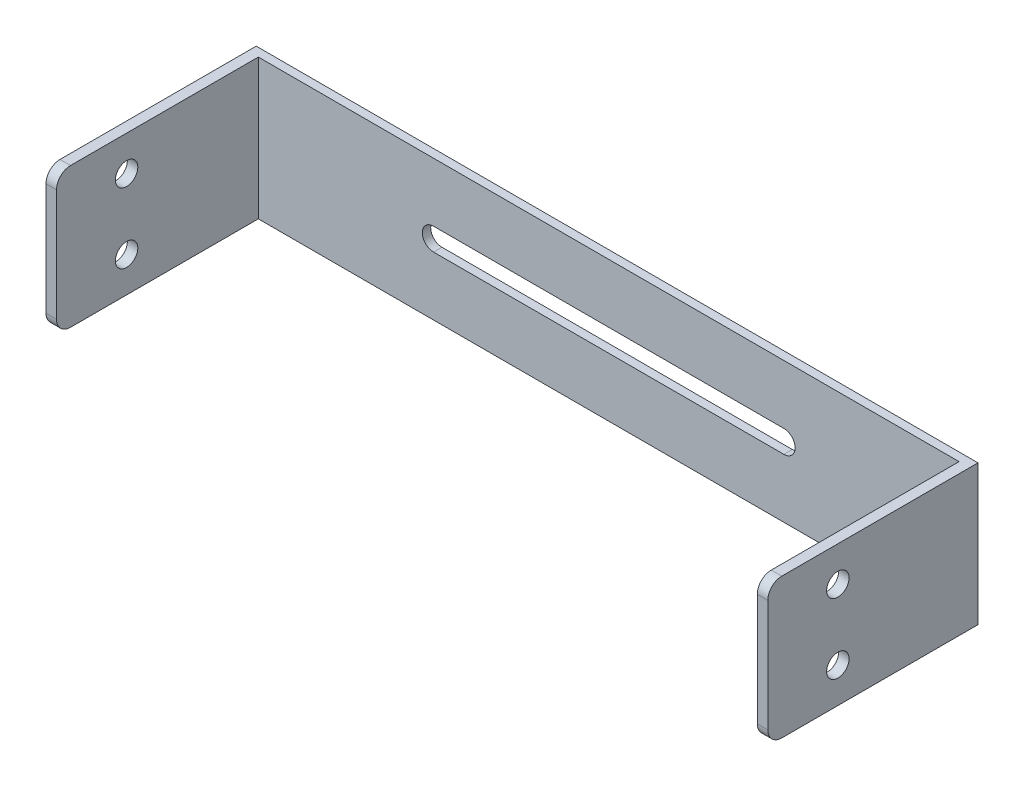
ISO-10303-21;
HEADER;
FILE_DESCRIPTION(('STEP AP214'),'2;1');
FILE_NAME('part.step','',(''),(''),'','','');
FILE_SCHEMA(('AUTOMOTIVE_DESIGN { 1 0 10303 214 1 1 1 1 }'));
ENDSEC;
DATA;
#1=APPLICATION_CONTEXT('core data for automotive mechanical design processes');
#2=APPLICATION_PROTOCOL_DEFINITION('international standard','automotive_design',2000,#1);
#3=PRODUCT_CONTEXT('',#1,'mechanical');
#4=PRODUCT('Part','Part','',(#3));
#5=PRODUCT_RELATED_PRODUCT_CATEGORY('part','',(#4));
#6=PRODUCT_DEFINITION_FORMATION('','',#4);
#7=PRODUCT_DEFINITION_CONTEXT('part definition',#1,'design');
#8=PRODUCT_DEFINITION('design','',#6,#7);
#9=PRODUCT_DEFINITION_SHAPE('','',#8);
#10=(LENGTH_UNIT() NAMED_UNIT(*) SI_UNIT(.MILLI.,.METRE.));
#11=(NAMED_UNIT(*) PLANE_ANGLE_UNIT() SI_UNIT($,.RADIAN.));
#12=(NAMED_UNIT(*) SI_UNIT($,.STERADIAN.) SOLID_ANGLE_UNIT());
#13=UNCERTAINTY_MEASURE_WITH_UNIT(LENGTH_MEASURE(1.E-05),#10,'distance_accuracy_value','');
#14=(GEOMETRIC_REPRESENTATION_CONTEXT(3) GLOBAL_UNCERTAINTY_ASSIGNED_CONTEXT((#13)) GLOBAL_UNIT_ASSIGNED_CONTEXT((#10,
#11,#12)) REPRESENTATION_CONTEXT('',''));
#15=CARTESIAN_POINT('',(0.,0.,0.));
#16=DIRECTION('',(0.,0.,1.));
#17=DIRECTION('',(1.,0.,0.));
#18=AXIS2_PLACEMENT_3D('',#15,#16,#17);
#19=CARTESIAN_POINT('',(65.,0.,0.));
#20=DIRECTION('',(1.,0.,0.));
#21=DIRECTION('',(0.,0.,1.));
#22=AXIS2_PLACEMENT_3D('',#19,#20,#21);
#23=PLANE('',#22);
#24=CARTESIAN_POINT('',(65.,49.0000000000004,-95.5));
#25=DIRECTION('',(1.,0.,0.));
#26=DIRECTION('',(0.,0.,-1.));
#27=AXIS2_PLACEMENT_3D('',#24,#25,#26);
#28=CIRCLE('',#27,1.60000000000001);
#29=CARTESIAN_POINT('',(65.,49.0000000000004,-97.1));
#30=VERTEX_POINT('',#29);
#31=EDGE_CURVE('E405',#30,#30,#28,.T.);
#32=ORIENTED_EDGE('',*,*,#31,.T.);
#33=EDGE_LOOP('',(#32));
#34=FACE_BOUND('',#33,.T.);
#35=CARTESIAN_POINT('',(65.,59.0000000000004,-95.5));
#36=DIRECTION('',(1.,0.,0.));
#37=DIRECTION('',(0.,0.,-1.));
#38=AXIS2_PLACEMENT_3D('',#35,#36,#37);
#39=CIRCLE('',#38,1.59999999999998);
#40=CARTESIAN_POINT('',(65.,59.0000000000004,-97.1));
#41=VERTEX_POINT('',#40);
#42=EDGE_CURVE('E399',#41,#41,#39,.T.);
#43=ORIENTED_EDGE('',*,*,#42,.T.);
#44=EDGE_LOOP('',(#43));
#45=FACE_BOUND('',#44,.T.);
#46=DIRECTION('',(0.,1.,0.));
#47=VECTOR('',#46,1.);
#48=CARTESIAN_POINT('',(65.,44.0000000000004,-85.5));
#49=LINE('',#48,#47);
#50=CARTESIAN_POINT('',(65.,46.0000000000004,-85.5));
#51=VERTEX_POINT('',#50);
#52=CARTESIAN_POINT('',(65.,62.0000000000004,-85.5));
#53=VERTEX_POINT('',#52);
#54=EDGE_CURVE('E207',#51,#53,#49,.T.);
#55=ORIENTED_EDGE('',*,*,#54,.T.);
#56=CARTESIAN_POINT('',(65.,62.0000000000004,-87.5));
#57=DIRECTION('',(1.,0.,0.));
#58=DIRECTION('',(0.,0.,-1.));
#59=AXIS2_PLACEMENT_3D('',#56,#57,#58);
#60=CIRCLE('',#59,2.);
#61=CARTESIAN_POINT('',(65.,64.0000000000004,-87.5));
#62=VERTEX_POINT('',#61);
#63=EDGE_CURVE('E244',#53,#62,#60,.F.);
#64=ORIENTED_EDGE('',*,*,#63,.T.);
#65=DIRECTION('',(0.,0.,-1.));
#66=VECTOR('',#65,1.);
#67=CARTESIAN_POINT('',(65.,64.0000000000004,-85.5));
#68=LINE('',#67,#66);
#69=CARTESIAN_POINT('',(65.,64.0000000000004,-114.3));
#70=VERTEX_POINT('',#69);
#71=EDGE_CURVE('E216',#62,#70,#68,.T.);
#72=ORIENTED_EDGE('',*,*,#71,.T.);
#73=DIRECTION('',(0.,1.,0.));
#74=VECTOR('',#73,1.);
#75=CARTESIAN_POINT('',(65.,64.0000000000004,-114.3));
#76=LINE('',#75,#74);
#77=CARTESIAN_POINT('',(65.,44.0000000000004,-114.3));
#78=VERTEX_POINT('',#77);
#79=EDGE_CURVE('E188',#78,#70,#76,.T.);
#80=ORIENTED_EDGE('',*,*,#79,.F.);
#81=DIRECTION('',(0.,0.,1.));
#82=VECTOR('',#81,1.);
#83=CARTESIAN_POINT('',(65.,44.0000000000004,-85.5));
#84=LINE('',#83,#82);
#85=CARTESIAN_POINT('',(65.,44.0000000000004,-87.5));
#86=VERTEX_POINT('',#85);
#87=EDGE_CURVE('E202',#78,#86,#84,.T.);
#88=ORIENTED_EDGE('',*,*,#87,.T.);
#89=CARTESIAN_POINT('',(65.,46.0000000000004,-87.5));
#90=DIRECTION('',(1.,0.,0.));
#91=DIRECTION('',(0.,0.,-1.));
#92=AXIS2_PLACEMENT_3D('',#89,#90,#91);
#93=CIRCLE('',#92,2.);
#94=EDGE_CURVE('E242',#86,#51,#93,.F.);
#95=ORIENTED_EDGE('',*,*,#94,.T.);
#96=EDGE_LOOP('',(#55,#64,#72,#80,#88,#95));
#97=FACE_BOUND('',#96,.T.);
#98=ADVANCED_FACE('F40',(#34,#45,#97),#23,.F.);
#99=CARTESIAN_POINT('',(-60.002,64.0000000000004,-114.3));
#100=DIRECTION('',(0.,0.,-1.));
#101=DIRECTION('',(-1.,0.,0.));
#102=AXIS2_PLACEMENT_3D('',#99,#100,#101);
#103=PLANE('',#102);
#104=DIRECTION('',(1.,0.,0.));
#105=VECTOR('',#104,1.);
#106=CARTESIAN_POINT('',(40.,52.4000000000004,-114.3));
#107=LINE('',#106,#105);
#108=CARTESIAN_POINT('',(-10.,52.4000000000004,-114.3));
#109=VERTEX_POINT('',#108);
#110=CARTESIAN_POINT('',(40.,52.4000000000004,-114.3));
#111=VERTEX_POINT('',#110);
#112=EDGE_CURVE('E408',#109,#111,#107,.T.);
#113=ORIENTED_EDGE('',*,*,#112,.F.);
#114=CARTESIAN_POINT('',(-10.,54.0000000000004,-114.3));
#115=DIRECTION('',(0.,0.,-1.));
#116=DIRECTION('',(-1.,0.,0.));
#117=AXIS2_PLACEMENT_3D('',#114,#115,#116);
#118=CIRCLE('',#117,1.60000000000001);
#119=CARTESIAN_POINT('',(-10.,55.6000000000005,-114.3));
#120=VERTEX_POINT('',#119);
#121=EDGE_CURVE('E183',#120,#109,#118,.F.);
#122=ORIENTED_EDGE('',*,*,#121,.F.);
#123=DIRECTION('',(-1.,0.,0.));
#124=VECTOR('',#123,1.);
#125=CARTESIAN_POINT('',(-9.99999999999999,55.6000000000005,-114.3));
#126=LINE('',#125,#124);
#127=CARTESIAN_POINT('',(40.,55.6000000000005,-114.3));
#128=VERTEX_POINT('',#127);
#129=EDGE_CURVE('E180',#128,#120,#126,.T.);
#130=ORIENTED_EDGE('',*,*,#129,.F.);
#131=CARTESIAN_POINT('',(40.,54.0000000000004,-114.3));
#132=DIRECTION('',(0.,0.,-1.));
#133=DIRECTION('',(-1.,0.,0.));
#134=AXIS2_PLACEMENT_3D('',#131,#132,#133);
#135=CIRCLE('',#134,1.60000000000002);
#136=EDGE_CURVE('E158',#111,#128,#135,.F.);
#137=ORIENTED_EDGE('',*,*,#136,.F.);
#138=EDGE_LOOP('',(#113,#122,#130,#137));
#139=FACE_BOUND('',#138,.T.);
#140=DIRECTION('',(0.,1.,0.));
#141=VECTOR('',#140,1.);
#142=CARTESIAN_POINT('',(-35.,64.0000000000004,-114.3));
#143=LINE('',#142,#141);
#144=CARTESIAN_POINT('',(-35.,44.0000000000004,-114.3));
#145=VERTEX_POINT('',#144);
#146=CARTESIAN_POINT('',(-35.,64.0000000000004,-114.3));
#147=VERTEX_POINT('',#146);
#148=EDGE_CURVE('E215',#145,#147,#143,.T.);
#149=ORIENTED_EDGE('',*,*,#148,.F.);
#150=DIRECTION('',(1.,0.,0.));
#151=VECTOR('',#150,1.);
#152=CARTESIAN_POINT('',(-60.002,44.0000000000004,-114.3));
#153=LINE('',#152,#151);
#154=EDGE_CURVE('E182',#145,#78,#153,.T.);
#155=ORIENTED_EDGE('',*,*,#154,.T.);
#156=ORIENTED_EDGE('',*,*,#79,.T.);
#157=DIRECTION('',(1.,0.,0.));
#158=VECTOR('',#157,1.);
#159=CARTESIAN_POINT('',(-60.002,64.0000000000004,-114.3));
#160=LINE('',#159,#158);
#161=EDGE_CURVE('E198',#147,#70,#160,.T.);
#162=ORIENTED_EDGE('',*,*,#161,.F.);
#163=EDGE_LOOP('',(#149,#155,#156,#162));
#164=FACE_BOUND('',#163,.T.);
#165=ADVANCED_FACE('F299',(#139,#164),#103,.F.);
#166=CARTESIAN_POINT('',(-36.5,44.0000000000004,-115.5));
#167=DIRECTION('',(0.,0.,1.));
#168=DIRECTION('',(1.,0.,0.));
#169=AXIS2_PLACEMENT_3D('',#166,#167,#168);
#170=PLANE('',#169);
#171=DIRECTION('',(1.,0.,0.));
#172=VECTOR('',#171,1.);
#173=CARTESIAN_POINT('',(-10.,55.6000000000005,-115.5));
#174=LINE('',#173,#172);
#175=CARTESIAN_POINT('',(-10.,55.6000000000005,-115.5));
#176=VERTEX_POINT('',#175);
#177=CARTESIAN_POINT('',(40.,55.6000000000005,-115.5));
#178=VERTEX_POINT('',#177);
#179=EDGE_CURVE('E164',#176,#178,#174,.T.);
#180=ORIENTED_EDGE('',*,*,#179,.F.);
#181=CARTESIAN_POINT('',(-10.,54.0000000000004,-115.5));
#182=DIRECTION('',(0.,0.,-1.));
#183=DIRECTION('',(-1.,0.,0.));
#184=AXIS2_PLACEMENT_3D('',#181,#182,#183);
#185=CIRCLE('',#184,1.60000000000001);
#186=CARTESIAN_POINT('',(-10.,52.4000000000004,-115.5));
#187=VERTEX_POINT('',#186);
#188=EDGE_CURVE('E63',#187,#176,#185,.T.);
#189=ORIENTED_EDGE('',*,*,#188,.F.);
#190=DIRECTION('',(-1.,0.,0.));
#191=VECTOR('',#190,1.);
#192=CARTESIAN_POINT('',(40.,52.4000000000004,-115.5));
#193=LINE('',#192,#191);
#194=CARTESIAN_POINT('',(40.,52.4000000000004,-115.5));
#195=VERTEX_POINT('',#194);
#196=EDGE_CURVE('E171',#195,#187,#193,.T.);
#197=ORIENTED_EDGE('',*,*,#196,.F.);
#198=CARTESIAN_POINT('',(40.,54.0000000000004,-115.5));
#199=DIRECTION('',(0.,0.,-1.));
#200=DIRECTION('',(-1.,0.,0.));
#201=AXIS2_PLACEMENT_3D('',#198,#199,#200);
#202=CIRCLE('',#201,1.60000000000002);
#203=EDGE_CURVE('E155',#178,#195,#202,.T.);
#204=ORIENTED_EDGE('',*,*,#203,.F.);
#205=EDGE_LOOP('',(#180,#189,#197,#204));
#206=FACE_BOUND('',#205,.T.);
#207=DIRECTION('',(1.,0.,0.));
#208=VECTOR('',#207,1.);
#209=CARTESIAN_POINT('',(-36.5,64.0000000000004,-115.5));
#210=LINE('',#209,#208);
#211=CARTESIAN_POINT('',(-36.5,64.0000000000004,-115.5));
#212=VERTEX_POINT('',#211);
#213=CARTESIAN_POINT('',(66.5,64.0000000000004,-115.5));
#214=VERTEX_POINT('',#213);
#215=EDGE_CURVE('E184',#212,#214,#210,.T.);
#216=ORIENTED_EDGE('',*,*,#215,.T.);
#217=DIRECTION('',(0.,-1.,0.));
#218=VECTOR('',#217,1.);
#219=CARTESIAN_POINT('',(66.5,44.0000000000004,-115.5));
#220=LINE('',#219,#218);
#221=CARTESIAN_POINT('',(66.5,44.0000000000004,-115.5));
#222=VERTEX_POINT('',#221);
#223=EDGE_CURVE('E187',#214,#222,#220,.T.);
#224=ORIENTED_EDGE('',*,*,#223,.T.);
#225=DIRECTION('',(1.,0.,0.));
#226=VECTOR('',#225,1.);
#227=CARTESIAN_POINT('',(-36.5,44.0000000000004,-115.5));
#228=LINE('',#227,#226);
#229=CARTESIAN_POINT('',(-36.5,44.0000000000004,-115.5));
#230=VERTEX_POINT('',#229);
#231=EDGE_CURVE('E189',#230,#222,#228,.T.);
#232=ORIENTED_EDGE('',*,*,#231,.F.);
#233=DIRECTION('',(0.,-1.,0.));
#234=VECTOR('',#233,1.);
#235=CARTESIAN_POINT('',(-36.5,44.0000000000004,-115.5));
#236=LINE('',#235,#234);
#237=EDGE_CURVE('E208',#212,#230,#236,.T.);
#238=ORIENTED_EDGE('',*,*,#237,.F.);
#239=EDGE_LOOP('',(#216,#224,#232,#238));
#240=FACE_BOUND('',#239,.T.);
#241=ADVANCED_FACE('F168',(#206,#240),#170,.F.);
#242=CARTESIAN_POINT('',(66.5,44.0000000000004,-85.5));
#243=DIRECTION('',(0.,0.,1.));
#244=DIRECTION('',(1.,0.,0.));
#245=AXIS2_PLACEMENT_3D('',#242,#243,#244);
#246=PLANE('',#245);
#247=DIRECTION('',(0.,1.,0.));
#248=VECTOR('',#247,1.);
#249=CARTESIAN_POINT('',(66.5,44.0000000000004,-85.5));
#250=LINE('',#249,#248);
#251=CARTESIAN_POINT('',(66.5,46.0000000000004,-85.5));
#252=VERTEX_POINT('',#251);
#253=CARTESIAN_POINT('',(66.5,62.0000000000004,-85.5));
#254=VERTEX_POINT('',#253);
#255=EDGE_CURVE('E192',#252,#254,#250,.T.);
#256=ORIENTED_EDGE('',*,*,#255,.T.);
#257=DIRECTION('',(-1.,0.,0.));
#258=VECTOR('',#257,1.);
#259=CARTESIAN_POINT('',(65.,62.0000000000004,-85.5));
#260=LINE('',#259,#258);
#261=EDGE_CURVE('E239',#254,#53,#260,.T.);
#262=ORIENTED_EDGE('',*,*,#261,.T.);
#263=ORIENTED_EDGE('',*,*,#54,.F.);
#264=DIRECTION('',(-1.,0.,0.));
#265=VECTOR('',#264,1.);
#266=CARTESIAN_POINT('',(66.5,46.0000000000004,-85.5));
#267=LINE('',#266,#265);
#268=EDGE_CURVE('E222',#51,#252,#267,.F.);
#269=ORIENTED_EDGE('',*,*,#268,.T.);
#270=EDGE_LOOP('',(#256,#262,#263,#269));
#271=FACE_BOUND('',#270,.T.);
#272=ADVANCED_FACE('F314',(#271),#246,.T.);
#273=CARTESIAN_POINT('',(-36.5,44.0000000000004,-85.5));
#274=DIRECTION('',(0.,1.,0.));
#275=DIRECTION('',(-1.,0.,0.));
#276=AXIS2_PLACEMENT_3D('',#273,#274,#275);
#277=PLANE('',#276);
#278=DIRECTION('',(0.,0.,1.));
#279=VECTOR('',#278,1.);
#280=CARTESIAN_POINT('',(66.5,44.0000000000004,-85.5));
#281=LINE('',#280,#279);
#282=CARTESIAN_POINT('',(66.5,44.0000000000004,-87.5));
#283=VERTEX_POINT('',#282);
#284=EDGE_CURVE('E191',#222,#283,#281,.T.);
#285=ORIENTED_EDGE('',*,*,#284,.T.);
#286=DIRECTION('',(-1.,0.,0.));
#287=VECTOR('',#286,1.);
#288=CARTESIAN_POINT('',(65.,44.0000000000004,-87.5));
#289=LINE('',#288,#287);
#290=EDGE_CURVE('E257',#283,#86,#289,.T.);
#291=ORIENTED_EDGE('',*,*,#290,.T.);
#292=ORIENTED_EDGE('',*,*,#87,.F.);
#293=ORIENTED_EDGE('',*,*,#154,.F.);
#294=DIRECTION('',(0.,0.,1.));
#295=VECTOR('',#294,1.);
#296=CARTESIAN_POINT('',(-35.,44.0000000000004,-85.5));
#297=LINE('',#296,#295);
#298=CARTESIAN_POINT('',(-35.,44.0000000000004,-87.5));
#299=VERTEX_POINT('',#298);
#300=EDGE_CURVE('E193',#145,#299,#297,.T.);
#301=ORIENTED_EDGE('',*,*,#300,.T.);
#302=DIRECTION('',(1.,0.,0.));
#303=VECTOR('',#302,1.);
#304=CARTESIAN_POINT('',(-36.5,44.0000000000004,-87.5));
#305=LINE('',#304,#303);
#306=CARTESIAN_POINT('',(-36.5,44.0000000000004,-87.5));
#307=VERTEX_POINT('',#306);
#308=EDGE_CURVE('E255',#299,#307,#305,.F.);
#309=ORIENTED_EDGE('',*,*,#308,.T.);
#310=DIRECTION('',(0.,0.,1.));
#311=VECTOR('',#310,1.);
#312=CARTESIAN_POINT('',(-36.5,44.0000000000004,-85.5));
#313=LINE('',#312,#311);
#314=EDGE_CURVE('E204',#230,#307,#313,.T.);
#315=ORIENTED_EDGE('',*,*,#314,.F.);
#316=ORIENTED_EDGE('',*,*,#231,.T.);
#317=EDGE_LOOP('',(#285,#291,#292,#293,#301,#309,#315,#316));
#318=FACE_BOUND('',#317,.T.);
#319=ADVANCED_FACE('F295',(#318),#277,.F.);
#320=CARTESIAN_POINT('',(-36.5,64.0000000000004,-85.5));
#321=DIRECTION('',(0.,-1.,0.));
#322=DIRECTION('',(1.,0.,0.));
#323=AXIS2_PLACEMENT_3D('',#320,#321,#322);
#324=PLANE('',#323);
#325=ORIENTED_EDGE('',*,*,#71,.F.);
#326=DIRECTION('',(-1.,0.,0.));
#327=VECTOR('',#326,1.);
#328=CARTESIAN_POINT('',(66.5,64.0000000000004,-87.5));
#329=LINE('',#328,#327);
#330=CARTESIAN_POINT('',(66.5,64.0000000000004,-87.5));
#331=VERTEX_POINT('',#330);
#332=EDGE_CURVE('E249',#62,#331,#329,.F.);
#333=ORIENTED_EDGE('',*,*,#332,.T.);
#334=DIRECTION('',(0.,0.,-1.));
#335=VECTOR('',#334,1.);
#336=CARTESIAN_POINT('',(66.5,64.0000000000004,-85.5));
#337=LINE('',#336,#335);
#338=EDGE_CURVE('E203',#331,#214,#337,.T.);
#339=ORIENTED_EDGE('',*,*,#338,.T.);
#340=ORIENTED_EDGE('',*,*,#215,.F.);
#341=DIRECTION('',(0.,0.,-1.));
#342=VECTOR('',#341,1.);
#343=CARTESIAN_POINT('',(-36.5,64.0000000000004,-85.5));
#344=LINE('',#343,#342);
#345=CARTESIAN_POINT('',(-36.5,64.0000000000004,-87.5));
#346=VERTEX_POINT('',#345);
#347=EDGE_CURVE('E210',#346,#212,#344,.T.);
#348=ORIENTED_EDGE('',*,*,#347,.F.);
#349=DIRECTION('',(1.,0.,0.));
#350=VECTOR('',#349,1.);
#351=CARTESIAN_POINT('',(-36.5,64.0000000000004,-87.5));
#352=LINE('',#351,#350);
#353=CARTESIAN_POINT('',(-35.,64.0000000000004,-87.5));
#354=VERTEX_POINT('',#353);
#355=EDGE_CURVE('E246',#346,#354,#352,.T.);
#356=ORIENTED_EDGE('',*,*,#355,.T.);
#357=DIRECTION('',(0.,0.,-1.));
#358=VECTOR('',#357,1.);
#359=CARTESIAN_POINT('',(-35.,64.0000000000004,-85.5));
#360=LINE('',#359,#358);
#361=EDGE_CURVE('E196',#354,#147,#360,.T.);
#362=ORIENTED_EDGE('',*,*,#361,.T.);
#363=ORIENTED_EDGE('',*,*,#161,.T.);
#364=EDGE_LOOP('',(#325,#333,#339,#340,#348,#356,#362,#363));
#365=FACE_BOUND('',#364,.T.);
#366=ADVANCED_FACE('F279',(#365),#324,.F.);
#367=CARTESIAN_POINT('',(-36.5,44.0000000000004,-85.5));
#368=DIRECTION('',(0.,0.,-1.));
#369=DIRECTION('',(-1.,0.,0.));
#370=AXIS2_PLACEMENT_3D('',#367,#368,#369);
#371=PLANE('',#370);
#372=DIRECTION('',(0.,1.,0.));
#373=VECTOR('',#372,1.);
#374=CARTESIAN_POINT('',(-36.5,44.0000000000004,-85.5));
#375=LINE('',#374,#373);
#376=CARTESIAN_POINT('',(-36.5,46.0000000000004,-85.5));
#377=VERTEX_POINT('',#376);
#378=CARTESIAN_POINT('',(-36.5,62.0000000000004,-85.5));
#379=VERTEX_POINT('',#378);
#380=EDGE_CURVE('E212',#377,#379,#375,.T.);
#381=ORIENTED_EDGE('',*,*,#380,.F.);
#382=DIRECTION('',(1.,0.,0.));
#383=VECTOR('',#382,1.);
#384=CARTESIAN_POINT('',(-36.5,46.0000000000004,-85.5));
#385=LINE('',#384,#383);
#386=CARTESIAN_POINT('',(-35.,46.0000000000004,-85.5));
#387=VERTEX_POINT('',#386);
#388=EDGE_CURVE('E262',#377,#387,#385,.T.);
#389=ORIENTED_EDGE('',*,*,#388,.T.);
#390=DIRECTION('',(0.,1.,0.));
#391=VECTOR('',#390,1.);
#392=CARTESIAN_POINT('',(-35.,44.0000000000004,-85.5));
#393=LINE('',#392,#391);
#394=CARTESIAN_POINT('',(-35.,62.0000000000004,-85.5));
#395=VERTEX_POINT('',#394);
#396=EDGE_CURVE('E199',#387,#395,#393,.T.);
#397=ORIENTED_EDGE('',*,*,#396,.T.);
#398=DIRECTION('',(1.,0.,0.));
#399=VECTOR('',#398,1.);
#400=CARTESIAN_POINT('',(-36.5,62.0000000000004,-85.5));
#401=LINE('',#400,#399);
#402=EDGE_CURVE('E260',#395,#379,#401,.F.);
#403=ORIENTED_EDGE('',*,*,#402,.T.);
#404=EDGE_LOOP('',(#381,#389,#397,#403));
#405=FACE_BOUND('',#404,.T.);
#406=ADVANCED_FACE('F286',(#405),#371,.F.);
#407=CARTESIAN_POINT('',(-35.,0.,0.));
#408=DIRECTION('',(-1.,0.,0.));
#409=DIRECTION('',(0.,0.,1.));
#410=AXIS2_PLACEMENT_3D('',#407,#408,#409);
#411=PLANE('',#410);
#412=CARTESIAN_POINT('',(-35.,49.0000000000004,-95.5));
#413=DIRECTION('',(-1.,0.,0.));
#414=DIRECTION('',(0.,0.,1.));
#415=AXIS2_PLACEMENT_3D('',#412,#413,#414);
#416=CIRCLE('',#415,1.60000000000001);
#417=CARTESIAN_POINT('',(-35.,49.0000000000004,-93.9));
#418=VERTEX_POINT('',#417);
#419=EDGE_CURVE('E402',#418,#418,#416,.T.);
#420=ORIENTED_EDGE('',*,*,#419,.T.);
#421=EDGE_LOOP('',(#420));
#422=FACE_BOUND('',#421,.T.);
#423=CARTESIAN_POINT('',(-35.,59.0000000000004,-95.5));
#424=DIRECTION('',(-1.,0.,0.));
#425=DIRECTION('',(0.,0.,1.));
#426=AXIS2_PLACEMENT_3D('',#423,#424,#425);
#427=CIRCLE('',#426,1.59999999999998);
#428=CARTESIAN_POINT('',(-35.,59.0000000000004,-93.9));
#429=VERTEX_POINT('',#428);
#430=EDGE_CURVE('E396',#429,#429,#427,.T.);
#431=ORIENTED_EDGE('',*,*,#430,.T.);
#432=EDGE_LOOP('',(#431));
#433=FACE_BOUND('',#432,.T.);
#434=ORIENTED_EDGE('',*,*,#396,.F.);
#435=CARTESIAN_POINT('',(-35.,46.0000000000004,-87.5));
#436=DIRECTION('',(-1.,0.,0.));
#437=DIRECTION('',(0.,0.,1.));
#438=AXIS2_PLACEMENT_3D('',#435,#436,#437);
#439=CIRCLE('',#438,2.);
#440=EDGE_CURVE('E267',#387,#299,#439,.F.);
#441=ORIENTED_EDGE('',*,*,#440,.T.);
#442=ORIENTED_EDGE('',*,*,#300,.F.);
#443=ORIENTED_EDGE('',*,*,#148,.T.);
#444=ORIENTED_EDGE('',*,*,#361,.F.);
#445=CARTESIAN_POINT('',(-35.,62.0000000000004,-87.5));
#446=DIRECTION('',(-1.,0.,0.));
#447=DIRECTION('',(0.,0.,1.));
#448=AXIS2_PLACEMENT_3D('',#445,#446,#447);
#449=CIRCLE('',#448,2.);
#450=EDGE_CURVE('E265',#354,#395,#449,.F.);
#451=ORIENTED_EDGE('',*,*,#450,.T.);
#452=EDGE_LOOP('',(#434,#441,#442,#443,#444,#451));
#453=FACE_BOUND('',#452,.T.);
#454=ADVANCED_FACE('F284',(#422,#433,#453),#411,.F.);
#455=CARTESIAN_POINT('',(66.5,0.,0.));
#456=DIRECTION('',(1.,0.,0.));
#457=DIRECTION('',(0.,0.,1.));
#458=AXIS2_PLACEMENT_3D('',#455,#456,#457);
#459=PLANE('',#458);
#460=CARTESIAN_POINT('',(66.5,49.0000000000004,-95.5));
#461=DIRECTION('',(-1.,0.,0.));
#462=DIRECTION('',(0.,0.,1.));
#463=AXIS2_PLACEMENT_3D('',#460,#461,#462);
#464=CIRCLE('',#463,1.60000000000001);
#465=CARTESIAN_POINT('',(66.5,49.0000000000004,-93.9));
#466=VERTEX_POINT('',#465);
#467=EDGE_CURVE('E390',#466,#466,#464,.T.);
#468=ORIENTED_EDGE('',*,*,#467,.T.);
#469=EDGE_LOOP('',(#468));
#470=FACE_BOUND('',#469,.T.);
#471=CARTESIAN_POINT('',(66.5,59.0000000000004,-95.5));
#472=DIRECTION('',(-1.,0.,0.));
#473=DIRECTION('',(0.,0.,1.));
#474=AXIS2_PLACEMENT_3D('',#471,#472,#473);
#475=CIRCLE('',#474,1.59999999999998);
#476=CARTESIAN_POINT('',(66.5,59.0000000000004,-93.9));
#477=VERTEX_POINT('',#476);
#478=EDGE_CURVE('E388',#477,#477,#475,.T.);
#479=ORIENTED_EDGE('',*,*,#478,.T.);
#480=EDGE_LOOP('',(#479));
#481=FACE_BOUND('',#480,.T.);
#482=ORIENTED_EDGE('',*,*,#338,.F.);
#483=CARTESIAN_POINT('',(66.5,62.0000000000004,-87.5));
#484=DIRECTION('',(1.,0.,0.));
#485=DIRECTION('',(0.,0.,-1.));
#486=AXIS2_PLACEMENT_3D('',#483,#484,#485);
#487=CIRCLE('',#486,2.);
#488=EDGE_CURVE('E253',#331,#254,#487,.T.);
#489=ORIENTED_EDGE('',*,*,#488,.T.);
#490=ORIENTED_EDGE('',*,*,#255,.F.);
#491=CARTESIAN_POINT('',(66.5,46.0000000000004,-87.5));
#492=DIRECTION('',(1.,0.,0.));
#493=DIRECTION('',(0.,0.,-1.));
#494=AXIS2_PLACEMENT_3D('',#491,#492,#493);
#495=CIRCLE('',#494,2.);
#496=EDGE_CURVE('E251',#252,#283,#495,.T.);
#497=ORIENTED_EDGE('',*,*,#496,.T.);
#498=ORIENTED_EDGE('',*,*,#284,.F.);
#499=ORIENTED_EDGE('',*,*,#223,.F.);
#500=EDGE_LOOP('',(#482,#489,#490,#497,#498,#499));
#501=FACE_BOUND('',#500,.T.);
#502=ADVANCED_FACE('F310',(#470,#481,#501),#459,.T.);
#503=CARTESIAN_POINT('',(-36.5,0.,0.));
#504=DIRECTION('',(-1.,0.,0.));
#505=DIRECTION('',(0.,0.,1.));
#506=AXIS2_PLACEMENT_3D('',#503,#504,#505);
#507=PLANE('',#506);
#508=CARTESIAN_POINT('',(-36.5,49.0000000000004,-95.5));
#509=DIRECTION('',(-1.,0.,0.));
#510=DIRECTION('',(0.,0.,1.));
#511=AXIS2_PLACEMENT_3D('',#508,#509,#510);
#512=CIRCLE('',#511,1.60000000000001);
#513=CARTESIAN_POINT('',(-36.5,49.0000000000004,-93.9));
#514=VERTEX_POINT('',#513);
#515=EDGE_CURVE('E383',#514,#514,#512,.T.);
#516=ORIENTED_EDGE('',*,*,#515,.F.);
#517=EDGE_LOOP('',(#516));
#518=FACE_BOUND('',#517,.T.);
#519=CARTESIAN_POINT('',(-36.5,59.0000000000004,-95.5));
#520=DIRECTION('',(-1.,0.,0.));
#521=DIRECTION('',(0.,0.,1.));
#522=AXIS2_PLACEMENT_3D('',#519,#520,#521);
#523=CIRCLE('',#522,1.59999999999998);
#524=CARTESIAN_POINT('',(-36.5,59.0000000000004,-93.9));
#525=VERTEX_POINT('',#524);
#526=EDGE_CURVE('E386',#525,#525,#523,.T.);
#527=ORIENTED_EDGE('',*,*,#526,.F.);
#528=EDGE_LOOP('',(#527));
#529=FACE_BOUND('',#528,.T.);
#530=ORIENTED_EDGE('',*,*,#314,.T.);
#531=CARTESIAN_POINT('',(-36.5,46.0000000000004,-87.5));
#532=DIRECTION('',(-1.,0.,0.));
#533=DIRECTION('',(0.,0.,1.));
#534=AXIS2_PLACEMENT_3D('',#531,#532,#533);
#535=CIRCLE('',#534,2.);
#536=EDGE_CURVE('E11',#307,#377,#535,.T.);
#537=ORIENTED_EDGE('',*,*,#536,.T.);
#538=ORIENTED_EDGE('',*,*,#380,.T.);
#539=CARTESIAN_POINT('',(-36.5,62.0000000000004,-87.5));
#540=DIRECTION('',(-1.,0.,0.));
#541=DIRECTION('',(0.,0.,1.));
#542=AXIS2_PLACEMENT_3D('',#539,#540,#541);
#543=CIRCLE('',#542,2.);
#544=EDGE_CURVE('E48',#379,#346,#543,.T.);
#545=ORIENTED_EDGE('',*,*,#544,.T.);
#546=ORIENTED_EDGE('',*,*,#347,.T.);
#547=ORIENTED_EDGE('',*,*,#237,.T.);
#548=EDGE_LOOP('',(#530,#537,#538,#545,#546,#547));
#549=FACE_BOUND('',#548,.T.);
#550=ADVANCED_FACE('F271',(#518,#529,#549),#507,.T.);
#551=CARTESIAN_POINT('',(66.5,62.0000000000004,-87.5));
#552=DIRECTION('',(1.,0.,0.));
#553=DIRECTION('',(0.,1.,0.));
#554=AXIS2_PLACEMENT_3D('',#551,#552,#553);
#555=CYLINDRICAL_SURFACE('',#554,2.);
#556=ORIENTED_EDGE('',*,*,#488,.F.);
#557=ORIENTED_EDGE('',*,*,#332,.F.);
#558=ORIENTED_EDGE('',*,*,#63,.F.);
#559=ORIENTED_EDGE('',*,*,#261,.F.);
#560=EDGE_LOOP('',(#556,#557,#558,#559));
#561=FACE_BOUND('',#560,.T.);
#562=ADVANCED_FACE('F306',(#561),#555,.T.);
#563=CARTESIAN_POINT('',(-36.5,46.0000000000004,-87.5));
#564=DIRECTION('',(1.,0.,0.));
#565=DIRECTION('',(0.,1.,0.));
#566=AXIS2_PLACEMENT_3D('',#563,#564,#565);
#567=CYLINDRICAL_SURFACE('',#566,2.);
#568=ORIENTED_EDGE('',*,*,#496,.F.);
#569=ORIENTED_EDGE('',*,*,#268,.F.);
#570=ORIENTED_EDGE('',*,*,#94,.F.);
#571=ORIENTED_EDGE('',*,*,#290,.F.);
#572=EDGE_LOOP('',(#568,#569,#570,#571));
#573=FACE_BOUND('',#572,.T.);
#574=ADVANCED_FACE('F318',(#573),#567,.T.);
#575=CARTESIAN_POINT('',(-36.5,46.0000000000004,-87.5));
#576=DIRECTION('',(1.,0.,0.));
#577=DIRECTION('',(0.,1.,0.));
#578=AXIS2_PLACEMENT_3D('',#575,#576,#577);
#579=CYLINDRICAL_SURFACE('',#578,2.);
#580=ORIENTED_EDGE('',*,*,#536,.F.);
#581=ORIENTED_EDGE('',*,*,#308,.F.);
#582=ORIENTED_EDGE('',*,*,#440,.F.);
#583=ORIENTED_EDGE('',*,*,#388,.F.);
#584=EDGE_LOOP('',(#580,#581,#582,#583));
#585=FACE_BOUND('',#584,.T.);
#586=ADVANCED_FACE('F290',(#585),#579,.T.);
#587=CARTESIAN_POINT('',(-36.5,62.0000000000004,-87.5));
#588=DIRECTION('',(1.,0.,0.));
#589=DIRECTION('',(0.,1.,0.));
#590=AXIS2_PLACEMENT_3D('',#587,#588,#589);
#591=CYLINDRICAL_SURFACE('',#590,2.);
#592=ORIENTED_EDGE('',*,*,#544,.F.);
#593=ORIENTED_EDGE('',*,*,#402,.F.);
#594=ORIENTED_EDGE('',*,*,#450,.F.);
#595=ORIENTED_EDGE('',*,*,#355,.F.);
#596=EDGE_LOOP('',(#592,#593,#594,#595));
#597=FACE_BOUND('',#596,.T.);
#598=ADVANCED_FACE('F42',(#597),#591,.T.);
#599=CARTESIAN_POINT('',(-10.,54.0000000000004,-61.0038462926263));
#600=DIRECTION('',(0.,0.,-1.));
#601=DIRECTION('',(-1.,0.,0.));
#602=AXIS2_PLACEMENT_3D('',#599,#600,#601);
#603=CYLINDRICAL_SURFACE('',#602,1.60000000000001);
#604=ORIENTED_EDGE('',*,*,#121,.T.);
#605=DIRECTION('',(0.,0.,-1.));
#606=VECTOR('',#605,1.);
#607=CARTESIAN_POINT('',(-10.,52.4000000000004,-61.0038462926263));
#608=LINE('',#607,#606);
#609=EDGE_CURVE('E176',#109,#187,#608,.T.);
#610=ORIENTED_EDGE('',*,*,#609,.T.);
#611=ORIENTED_EDGE('',*,*,#188,.T.);
#612=DIRECTION('',(0.,0.,-1.));
#613=VECTOR('',#612,1.);
#614=CARTESIAN_POINT('',(-10.,55.6000000000005,-61.0038462926263));
#615=LINE('',#614,#613);
#616=EDGE_CURVE('E161',#120,#176,#615,.T.);
#617=ORIENTED_EDGE('',*,*,#616,.F.);
#618=EDGE_LOOP('',(#604,#610,#611,#617));
#619=FACE_BOUND('',#618,.T.);
#620=ADVANCED_FACE('F352',(#619),#603,.F.);
#621=CARTESIAN_POINT('',(40.,52.4000000000004,-61.0038462926263));
#622=DIRECTION('',(0.,-1.,0.));
#623=DIRECTION('',(0.,0.,-1.));
#624=AXIS2_PLACEMENT_3D('',#621,#622,#623);
#625=PLANE('',#624);
#626=ORIENTED_EDGE('',*,*,#112,.T.);
#627=DIRECTION('',(0.,0.,-1.));
#628=VECTOR('',#627,1.);
#629=CARTESIAN_POINT('',(40.,52.4000000000004,-61.0038462926263));
#630=LINE('',#629,#628);
#631=EDGE_CURVE('E160',#111,#195,#630,.T.);
#632=ORIENTED_EDGE('',*,*,#631,.T.);
#633=ORIENTED_EDGE('',*,*,#196,.T.);
#634=ORIENTED_EDGE('',*,*,#609,.F.);
#635=EDGE_LOOP('',(#626,#632,#633,#634));
#636=FACE_BOUND('',#635,.T.);
#637=ADVANCED_FACE('F356',(#636),#625,.F.);
#638=CARTESIAN_POINT('',(40.,54.0000000000004,-61.0038462926263));
#639=DIRECTION('',(0.,0.,-1.));
#640=DIRECTION('',(-1.,0.,0.));
#641=AXIS2_PLACEMENT_3D('',#638,#639,#640);
#642=CYLINDRICAL_SURFACE('',#641,1.60000000000002);
#643=ORIENTED_EDGE('',*,*,#136,.T.);
#644=DIRECTION('',(0.,0.,-1.));
#645=VECTOR('',#644,1.);
#646=CARTESIAN_POINT('',(40.,55.6000000000005,-61.0038462926263));
#647=LINE('',#646,#645);
#648=EDGE_CURVE('E55',#128,#178,#647,.T.);
#649=ORIENTED_EDGE('',*,*,#648,.T.);
#650=ORIENTED_EDGE('',*,*,#203,.T.);
#651=ORIENTED_EDGE('',*,*,#631,.F.);
#652=EDGE_LOOP('',(#643,#649,#650,#651));
#653=FACE_BOUND('',#652,.T.);
#654=ADVANCED_FACE('F152',(#653),#642,.F.);
#655=CARTESIAN_POINT('',(-10.,55.6000000000005,-61.0038462926263));
#656=DIRECTION('',(0.,1.,0.));
#657=DIRECTION('',(-1.,0.,0.));
#658=AXIS2_PLACEMENT_3D('',#655,#656,#657);
#659=PLANE('',#658);
#660=ORIENTED_EDGE('',*,*,#129,.T.);
#661=ORIENTED_EDGE('',*,*,#616,.T.);
#662=ORIENTED_EDGE('',*,*,#179,.T.);
#663=ORIENTED_EDGE('',*,*,#648,.F.);
#664=EDGE_LOOP('',(#660,#661,#662,#663));
#665=FACE_BOUND('',#664,.T.);
#666=ADVANCED_FACE('F165',(#665),#659,.F.);
#667=CARTESIAN_POINT('',(66.5,59.0000000000004,-95.5));
#668=DIRECTION('',(-1.,0.,0.));
#669=DIRECTION('',(0.,0.,1.));
#670=AXIS2_PLACEMENT_3D('',#667,#668,#669);
#671=CYLINDRICAL_SURFACE('',#670,1.59999999999998);
#672=ORIENTED_EDGE('',*,*,#526,.T.);
#673=EDGE_LOOP('',(#672));
#674=FACE_BOUND('',#673,.T.);
#675=ORIENTED_EDGE('',*,*,#430,.F.);
#676=EDGE_LOOP('',(#675));
#677=FACE_BOUND('',#676,.T.);
#678=ADVANCED_FACE('F426',(#674,#677),#671,.F.);
#679=CARTESIAN_POINT('',(66.5,49.0000000000004,-95.5));
#680=DIRECTION('',(-1.,0.,0.));
#681=DIRECTION('',(0.,0.,1.));
#682=AXIS2_PLACEMENT_3D('',#679,#680,#681);
#683=CYLINDRICAL_SURFACE('',#682,1.60000000000001);
#684=ORIENTED_EDGE('',*,*,#515,.T.);
#685=EDGE_LOOP('',(#684));
#686=FACE_BOUND('',#685,.T.);
#687=ORIENTED_EDGE('',*,*,#419,.F.);
#688=EDGE_LOOP('',(#687));
#689=FACE_BOUND('',#688,.T.);
#690=ADVANCED_FACE('F420',(#686,#689),#683,.F.);
#691=ORIENTED_EDGE('',*,*,#478,.F.);
#692=EDGE_LOOP('',(#691));
#693=FACE_BOUND('',#692,.T.);
#694=ORIENTED_EDGE('',*,*,#42,.F.);
#695=EDGE_LOOP('',(#694));
#696=FACE_BOUND('',#695,.T.);
#697=ADVANCED_FACE('F417',(#693,#696),#671,.F.);
#698=ORIENTED_EDGE('',*,*,#467,.F.);
#699=EDGE_LOOP('',(#698));
#700=FACE_BOUND('',#699,.T.);
#701=ORIENTED_EDGE('',*,*,#31,.F.);
#702=EDGE_LOOP('',(#701));
#703=FACE_BOUND('',#702,.T.);
#704=ADVANCED_FACE('F415',(#700,#703),#683,.F.);
#705=CLOSED_SHELL('',(#98,#165,#241,#272,#319,#366,#406,#454,#502,#550,#562,#574,#586,#598,#620,
#637,#654,#666,#678,#690,#697,#704));
#706=MANIFOLD_SOLID_BREP('B2',#705);
#707=ADVANCED_BREP_SHAPE_REPRESENTATION('',(#18,#706),#14);
#708=SHAPE_DEFINITION_REPRESENTATION(#9,#707);
ENDSEC;
END-ISO-10303-21;
